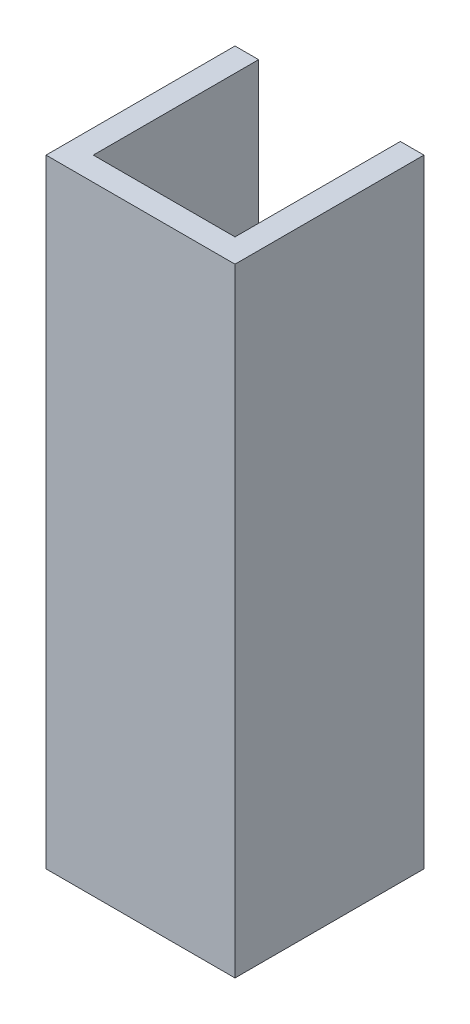
ISO-10303-21;
HEADER;
FILE_DESCRIPTION(('STEP AP214'),'2;1');
FILE_NAME('part.step','',(''),(''),'','','');
FILE_SCHEMA(('AUTOMOTIVE_DESIGN { 1 0 10303 214 1 1 1 1 }'));
ENDSEC;
DATA;
#1=APPLICATION_CONTEXT('core data for automotive mechanical design processes');
#2=APPLICATION_PROTOCOL_DEFINITION('international standard','automotive_design',2000,#1);
#3=PRODUCT_CONTEXT('',#1,'mechanical');
#4=PRODUCT('Part','Part','',(#3));
#5=PRODUCT_RELATED_PRODUCT_CATEGORY('part','',(#4));
#6=PRODUCT_DEFINITION_FORMATION('','',#4);
#7=PRODUCT_DEFINITION_CONTEXT('part definition',#1,'design');
#8=PRODUCT_DEFINITION('design','',#6,#7);
#9=PRODUCT_DEFINITION_SHAPE('','',#8);
#10=(LENGTH_UNIT() NAMED_UNIT(*) SI_UNIT(.MILLI.,.METRE.));
#11=(NAMED_UNIT(*) PLANE_ANGLE_UNIT() SI_UNIT($,.RADIAN.));
#12=(NAMED_UNIT(*) SI_UNIT($,.STERADIAN.) SOLID_ANGLE_UNIT());
#13=UNCERTAINTY_MEASURE_WITH_UNIT(LENGTH_MEASURE(1.E-05),#10,'distance_accuracy_value','');
#14=(GEOMETRIC_REPRESENTATION_CONTEXT(3) GLOBAL_UNCERTAINTY_ASSIGNED_CONTEXT((#13)) GLOBAL_UNIT_ASSIGNED_CONTEXT((#10,
#11,#12)) REPRESENTATION_CONTEXT('',''));
#15=CARTESIAN_POINT('',(0.,0.,0.));
#16=DIRECTION('',(0.,0.,1.));
#17=DIRECTION('',(1.,0.,0.));
#18=AXIS2_PLACEMENT_3D('',#15,#16,#17);
#19=CARTESIAN_POINT('',(25.4,83.1,0.));
#20=DIRECTION('',(-1.,0.,0.));
#21=DIRECTION('',(0.,0.,1.));
#22=AXIS2_PLACEMENT_3D('',#19,#20,#21);
#23=PLANE('',#22);
#24=DIRECTION('',(0.,0.,-1.));
#25=VECTOR('',#24,1.);
#26=CARTESIAN_POINT('',(25.4,0.,0.));
#27=LINE('',#26,#25);
#28=CARTESIAN_POINT('',(25.4,0.,0.));
#29=VERTEX_POINT('',#28);
#30=CARTESIAN_POINT('',(25.4,0.,-25.4));
#31=VERTEX_POINT('',#30);
#32=EDGE_CURVE('E130',#29,#31,#27,.T.);
#33=ORIENTED_EDGE('',*,*,#32,.T.);
#34=DIRECTION('',(0.,-1.,0.));
#35=VECTOR('',#34,1.);
#36=CARTESIAN_POINT('',(25.4,83.1,-25.4));
#37=LINE('',#36,#35);
#38=CARTESIAN_POINT('',(25.4,83.1,-25.4));
#39=VERTEX_POINT('',#38);
#40=EDGE_CURVE('E11',#39,#31,#37,.T.);
#41=ORIENTED_EDGE('',*,*,#40,.F.);
#42=DIRECTION('',(0.,0.,-1.));
#43=VECTOR('',#42,1.);
#44=CARTESIAN_POINT('',(25.4,83.1,0.));
#45=LINE('',#44,#43);
#46=CARTESIAN_POINT('',(25.4,83.1,0.));
#47=VERTEX_POINT('',#46);
#48=EDGE_CURVE('E88',#47,#39,#45,.T.);
#49=ORIENTED_EDGE('',*,*,#48,.F.);
#50=DIRECTION('',(0.,-1.,0.));
#51=VECTOR('',#50,1.);
#52=CARTESIAN_POINT('',(25.4,83.1,0.));
#53=LINE('',#52,#51);
#54=EDGE_CURVE('E129',#47,#29,#53,.T.);
#55=ORIENTED_EDGE('',*,*,#54,.T.);
#56=EDGE_LOOP('',(#33,#41,#49,#55));
#57=FACE_BOUND('',#56,.T.);
#58=ADVANCED_FACE('F33',(#57),#23,.F.);
#59=CARTESIAN_POINT('',(22.225,83.1,-25.4));
#60=DIRECTION('',(0.,0.,-1.));
#61=DIRECTION('',(-1.,0.,0.));
#62=AXIS2_PLACEMENT_3D('',#59,#60,#61);
#63=PLANE('',#62);
#64=DIRECTION('',(1.,0.,0.));
#65=VECTOR('',#64,1.);
#66=CARTESIAN_POINT('',(22.225,0.,-25.4));
#67=LINE('',#66,#65);
#68=CARTESIAN_POINT('',(22.225,0.,-25.4));
#69=VERTEX_POINT('',#68);
#70=EDGE_CURVE('E133',#69,#31,#67,.T.);
#71=ORIENTED_EDGE('',*,*,#70,.F.);
#72=DIRECTION('',(0.,-1.,0.));
#73=VECTOR('',#72,1.);
#74=CARTESIAN_POINT('',(22.225,83.1,-25.4));
#75=LINE('',#74,#73);
#76=CARTESIAN_POINT('',(22.225,83.1,-25.4));
#77=VERTEX_POINT('',#76);
#78=EDGE_CURVE('E41',#77,#69,#75,.T.);
#79=ORIENTED_EDGE('',*,*,#78,.F.);
#80=DIRECTION('',(1.,0.,0.));
#81=VECTOR('',#80,1.);
#82=CARTESIAN_POINT('',(22.225,83.1,-25.4));
#83=LINE('',#82,#81);
#84=EDGE_CURVE('E172',#77,#39,#83,.T.);
#85=ORIENTED_EDGE('',*,*,#84,.T.);
#86=ORIENTED_EDGE('',*,*,#40,.T.);
#87=EDGE_LOOP('',(#71,#79,#85,#86));
#88=FACE_BOUND('',#87,.T.);
#89=ADVANCED_FACE('F163',(#88),#63,.T.);
#90=CARTESIAN_POINT('',(22.225,83.1,0.));
#91=DIRECTION('',(-1.,0.,0.));
#92=DIRECTION('',(0.,0.,1.));
#93=AXIS2_PLACEMENT_3D('',#90,#91,#92);
#94=PLANE('',#93);
#95=DIRECTION('',(0.,0.,-1.));
#96=VECTOR('',#95,1.);
#97=CARTESIAN_POINT('',(22.225,0.,0.));
#98=LINE('',#97,#96);
#99=CARTESIAN_POINT('',(22.225,0.,-3.175));
#100=VERTEX_POINT('',#99);
#101=EDGE_CURVE('E136',#100,#69,#98,.T.);
#102=ORIENTED_EDGE('',*,*,#101,.F.);
#103=DIRECTION('',(0.,-1.,0.));
#104=VECTOR('',#103,1.);
#105=CARTESIAN_POINT('',(22.225,83.1,-3.175));
#106=LINE('',#105,#104);
#107=CARTESIAN_POINT('',(22.225,83.1,-3.175));
#108=VERTEX_POINT('',#107);
#109=EDGE_CURVE('E153',#108,#100,#106,.T.);
#110=ORIENTED_EDGE('',*,*,#109,.F.);
#111=DIRECTION('',(0.,0.,-1.));
#112=VECTOR('',#111,1.);
#113=CARTESIAN_POINT('',(22.225,83.1,0.));
#114=LINE('',#113,#112);
#115=EDGE_CURVE('E160',#108,#77,#114,.T.);
#116=ORIENTED_EDGE('',*,*,#115,.T.);
#117=ORIENTED_EDGE('',*,*,#78,.T.);
#118=EDGE_LOOP('',(#102,#110,#116,#117));
#119=FACE_BOUND('',#118,.T.);
#120=ADVANCED_FACE('F158',(#119),#94,.T.);
#121=CARTESIAN_POINT('',(0.,83.1,-3.175));
#122=DIRECTION('',(0.,0.,-1.));
#123=DIRECTION('',(-1.,0.,0.));
#124=AXIS2_PLACEMENT_3D('',#121,#122,#123);
#125=PLANE('',#124);
#126=DIRECTION('',(1.,0.,0.));
#127=VECTOR('',#126,1.);
#128=CARTESIAN_POINT('',(0.,0.,-3.175));
#129=LINE('',#128,#127);
#130=CARTESIAN_POINT('',(3.175,0.,-3.175));
#131=VERTEX_POINT('',#130);
#132=EDGE_CURVE('E139',#131,#100,#129,.T.);
#133=ORIENTED_EDGE('',*,*,#132,.F.);
#134=DIRECTION('',(0.,-1.,0.));
#135=VECTOR('',#134,1.);
#136=CARTESIAN_POINT('',(3.175,83.1,-3.175));
#137=LINE('',#136,#135);
#138=CARTESIAN_POINT('',(3.175,83.1,-3.175));
#139=VERTEX_POINT('',#138);
#140=EDGE_CURVE('E151',#139,#131,#137,.T.);
#141=ORIENTED_EDGE('',*,*,#140,.F.);
#142=DIRECTION('',(1.,0.,0.));
#143=VECTOR('',#142,1.);
#144=CARTESIAN_POINT('',(0.,83.1,-3.175));
#145=LINE('',#144,#143);
#146=EDGE_CURVE('E124',#139,#108,#145,.T.);
#147=ORIENTED_EDGE('',*,*,#146,.T.);
#148=ORIENTED_EDGE('',*,*,#109,.T.);
#149=EDGE_LOOP('',(#133,#141,#147,#148));
#150=FACE_BOUND('',#149,.T.);
#151=ADVANCED_FACE('F170',(#150),#125,.T.);
#152=CARTESIAN_POINT('',(3.175,83.1,-25.4));
#153=DIRECTION('',(1.,0.,0.));
#154=DIRECTION('',(0.,0.,-1.));
#155=AXIS2_PLACEMENT_3D('',#152,#153,#154);
#156=PLANE('',#155);
#157=DIRECTION('',(0.,0.,-1.));
#158=VECTOR('',#157,1.);
#159=CARTESIAN_POINT('',(3.175,0.,-25.4));
#160=LINE('',#159,#158);
#161=CARTESIAN_POINT('',(3.175,0.,-25.4));
#162=VERTEX_POINT('',#161);
#163=EDGE_CURVE('E142',#162,#131,#160,.F.);
#164=ORIENTED_EDGE('',*,*,#163,.F.);
#165=DIRECTION('',(0.,-1.,0.));
#166=VECTOR('',#165,1.);
#167=CARTESIAN_POINT('',(3.175,83.1,-25.4));
#168=LINE('',#167,#166);
#169=CARTESIAN_POINT('',(3.175,83.1,-25.4));
#170=VERTEX_POINT('',#169);
#171=EDGE_CURVE('E112',#170,#162,#168,.T.);
#172=ORIENTED_EDGE('',*,*,#171,.F.);
#173=DIRECTION('',(0.,0.,-1.));
#174=VECTOR('',#173,1.);
#175=CARTESIAN_POINT('',(3.175,83.1,-25.4));
#176=LINE('',#175,#174);
#177=EDGE_CURVE('E122',#170,#139,#176,.F.);
#178=ORIENTED_EDGE('',*,*,#177,.T.);
#179=ORIENTED_EDGE('',*,*,#140,.T.);
#180=EDGE_LOOP('',(#164,#172,#178,#179));
#181=FACE_BOUND('',#180,.T.);
#182=ADVANCED_FACE('F177',(#181),#156,.T.);
#183=CARTESIAN_POINT('',(0.,83.1,-25.4));
#184=DIRECTION('',(0.,0.,-1.));
#185=DIRECTION('',(-1.,0.,0.));
#186=AXIS2_PLACEMENT_3D('',#183,#184,#185);
#187=PLANE('',#186);
#188=DIRECTION('',(1.,0.,0.));
#189=VECTOR('',#188,1.);
#190=CARTESIAN_POINT('',(0.,0.,-25.4));
#191=LINE('',#190,#189);
#192=CARTESIAN_POINT('',(0.,0.,-25.4));
#193=VERTEX_POINT('',#192);
#194=EDGE_CURVE('E111',#193,#162,#191,.T.);
#195=ORIENTED_EDGE('',*,*,#194,.F.);
#196=DIRECTION('',(0.,-1.,0.));
#197=VECTOR('',#196,1.);
#198=CARTESIAN_POINT('',(0.,83.1,-25.4));
#199=LINE('',#198,#197);
#200=CARTESIAN_POINT('',(0.,83.1,-25.4));
#201=VERTEX_POINT('',#200);
#202=EDGE_CURVE('E105',#201,#193,#199,.T.);
#203=ORIENTED_EDGE('',*,*,#202,.F.);
#204=DIRECTION('',(1.,0.,0.));
#205=VECTOR('',#204,1.);
#206=CARTESIAN_POINT('',(0.,83.1,-25.4));
#207=LINE('',#206,#205);
#208=EDGE_CURVE('E109',#201,#170,#207,.T.);
#209=ORIENTED_EDGE('',*,*,#208,.T.);
#210=ORIENTED_EDGE('',*,*,#171,.T.);
#211=EDGE_LOOP('',(#195,#203,#209,#210));
#212=FACE_BOUND('',#211,.T.);
#213=ADVANCED_FACE('F107',(#212),#187,.T.);
#214=CARTESIAN_POINT('',(0.,83.1,-25.4));
#215=DIRECTION('',(1.,0.,0.));
#216=DIRECTION('',(0.,0.,-1.));
#217=AXIS2_PLACEMENT_3D('',#214,#215,#216);
#218=PLANE('',#217);
#219=DIRECTION('',(0.,0.,1.));
#220=VECTOR('',#219,1.);
#221=CARTESIAN_POINT('',(0.,0.,-25.4));
#222=LINE('',#221,#220);
#223=CARTESIAN_POINT('',(0.,0.,0.));
#224=VERTEX_POINT('',#223);
#225=EDGE_CURVE('E76',#193,#224,#222,.T.);
#226=ORIENTED_EDGE('',*,*,#225,.T.);
#227=DIRECTION('',(0.,-1.,0.));
#228=VECTOR('',#227,1.);
#229=CARTESIAN_POINT('',(0.,83.1,0.));
#230=LINE('',#229,#228);
#231=CARTESIAN_POINT('',(0.,83.1,0.));
#232=VERTEX_POINT('',#231);
#233=EDGE_CURVE('E113',#232,#224,#230,.T.);
#234=ORIENTED_EDGE('',*,*,#233,.F.);
#235=DIRECTION('',(0.,0.,1.));
#236=VECTOR('',#235,1.);
#237=CARTESIAN_POINT('',(0.,83.1,-25.4));
#238=LINE('',#237,#236);
#239=EDGE_CURVE('E115',#201,#232,#238,.T.);
#240=ORIENTED_EDGE('',*,*,#239,.F.);
#241=ORIENTED_EDGE('',*,*,#202,.T.);
#242=EDGE_LOOP('',(#226,#234,#240,#241));
#243=FACE_BOUND('',#242,.T.);
#244=ADVANCED_FACE('F116',(#243),#218,.F.);
#245=CARTESIAN_POINT('',(0.,83.1,0.));
#246=DIRECTION('',(0.,0.,-1.));
#247=DIRECTION('',(-1.,0.,0.));
#248=AXIS2_PLACEMENT_3D('',#245,#246,#247);
#249=PLANE('',#248);
#250=DIRECTION('',(1.,0.,0.));
#251=VECTOR('',#250,1.);
#252=CARTESIAN_POINT('',(0.,0.,0.));
#253=LINE('',#252,#251);
#254=EDGE_CURVE('E82',#224,#29,#253,.T.);
#255=ORIENTED_EDGE('',*,*,#254,.T.);
#256=ORIENTED_EDGE('',*,*,#54,.F.);
#257=DIRECTION('',(1.,0.,0.));
#258=VECTOR('',#257,1.);
#259=CARTESIAN_POINT('',(0.,83.1,0.));
#260=LINE('',#259,#258);
#261=EDGE_CURVE('E49',#232,#47,#260,.T.);
#262=ORIENTED_EDGE('',*,*,#261,.F.);
#263=ORIENTED_EDGE('',*,*,#233,.T.);
#264=EDGE_LOOP('',(#255,#256,#262,#263));
#265=FACE_BOUND('',#264,.T.);
#266=ADVANCED_FACE('F179',(#265),#249,.F.);
#267=CARTESIAN_POINT('',(0.,83.1,0.));
#268=DIRECTION('',(0.,-1.,0.));
#269=DIRECTION('',(-1.,0.,0.));
#270=AXIS2_PLACEMENT_3D('',#267,#268,#269);
#271=PLANE('',#270);
#272=ORIENTED_EDGE('',*,*,#48,.T.);
#273=ORIENTED_EDGE('',*,*,#84,.F.);
#274=ORIENTED_EDGE('',*,*,#115,.F.);
#275=ORIENTED_EDGE('',*,*,#146,.F.);
#276=ORIENTED_EDGE('',*,*,#177,.F.);
#277=ORIENTED_EDGE('',*,*,#208,.F.);
#278=ORIENTED_EDGE('',*,*,#239,.T.);
#279=ORIENTED_EDGE('',*,*,#261,.T.);
#280=EDGE_LOOP('',(#272,#273,#274,#275,#276,#277,#278,#279));
#281=FACE_BOUND('',#280,.T.);
#282=ADVANCED_FACE('F119',(#281),#271,.F.);
#283=CARTESIAN_POINT('',(0.,0.,0.));
#284=DIRECTION('',(0.,-1.,0.));
#285=DIRECTION('',(-1.,0.,0.));
#286=AXIS2_PLACEMENT_3D('',#283,#284,#285);
#287=PLANE('',#286);
#288=ORIENTED_EDGE('',*,*,#32,.F.);
#289=ORIENTED_EDGE('',*,*,#254,.F.);
#290=ORIENTED_EDGE('',*,*,#225,.F.);
#291=ORIENTED_EDGE('',*,*,#194,.T.);
#292=ORIENTED_EDGE('',*,*,#163,.T.);
#293=ORIENTED_EDGE('',*,*,#132,.T.);
#294=ORIENTED_EDGE('',*,*,#101,.T.);
#295=ORIENTED_EDGE('',*,*,#70,.T.);
#296=EDGE_LOOP('',(#288,#289,#290,#291,#292,#293,#294,#295));
#297=FACE_BOUND('',#296,.T.);
#298=ADVANCED_FACE('F166',(#297),#287,.T.);
#299=CLOSED_SHELL('',(#58,#89,#120,#151,#182,#213,#244,#266,#282,#298));
#300=MANIFOLD_SOLID_BREP('B2',#299);
#301=ADVANCED_BREP_SHAPE_REPRESENTATION('',(#18,#300),#14);
#302=SHAPE_DEFINITION_REPRESENTATION(#9,#301);
ENDSEC;
END-ISO-10303-21;
